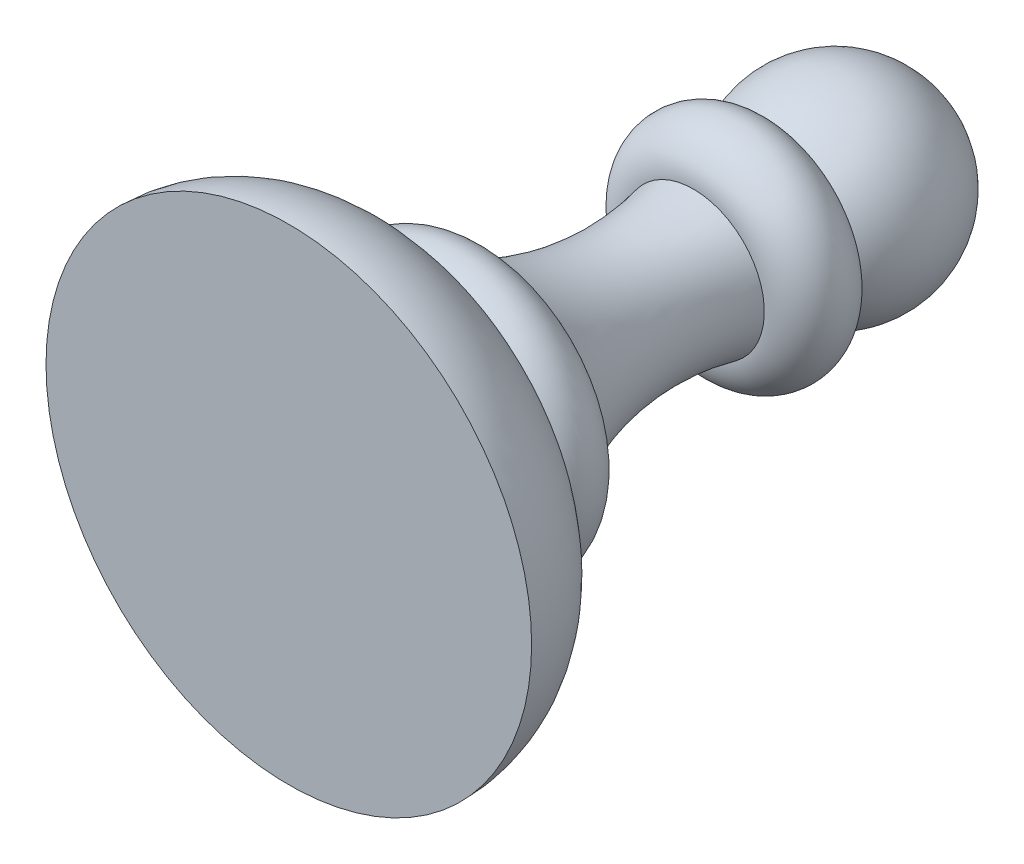
ISO-10303-21;
HEADER;
FILE_DESCRIPTION(('STEP AP214'),'2;1');
FILE_NAME('part.step','',(''),(''),'','','');
FILE_SCHEMA(('AUTOMOTIVE_DESIGN { 1 0 10303 214 1 1 1 1 }'));
ENDSEC;
DATA;
#1=APPLICATION_CONTEXT('core data for automotive mechanical design processes');
#2=APPLICATION_PROTOCOL_DEFINITION('international standard','automotive_design',2000,#1);
#3=PRODUCT_CONTEXT('',#1,'mechanical');
#4=PRODUCT('Part','Part','',(#3));
#5=PRODUCT_RELATED_PRODUCT_CATEGORY('part','',(#4));
#6=PRODUCT_DEFINITION_FORMATION('','',#4);
#7=PRODUCT_DEFINITION_CONTEXT('part definition',#1,'design');
#8=PRODUCT_DEFINITION('design','',#6,#7);
#9=PRODUCT_DEFINITION_SHAPE('','',#8);
#10=(LENGTH_UNIT() NAMED_UNIT(*) SI_UNIT(.MILLI.,.METRE.));
#11=(NAMED_UNIT(*) PLANE_ANGLE_UNIT() SI_UNIT($,.RADIAN.));
#12=(NAMED_UNIT(*) SI_UNIT($,.STERADIAN.) SOLID_ANGLE_UNIT());
#13=UNCERTAINTY_MEASURE_WITH_UNIT(LENGTH_MEASURE(1.E-05),#10,'distance_accuracy_value','');
#14=(GEOMETRIC_REPRESENTATION_CONTEXT(3) GLOBAL_UNCERTAINTY_ASSIGNED_CONTEXT((#13)) GLOBAL_UNIT_ASSIGNED_CONTEXT((#10,
#11,#12)) REPRESENTATION_CONTEXT('',''));
#15=CARTESIAN_POINT('',(0.,0.,0.));
#16=DIRECTION('',(0.,0.,1.));
#17=DIRECTION('',(1.,0.,0.));
#18=AXIS2_PLACEMENT_3D('',#15,#16,#17);
#19=CARTESIAN_POINT('',(0.,0.,135.));
#20=DIRECTION('',(0.,0.,-1.));
#21=DIRECTION('',(-1.,0.,0.));
#22=AXIS2_PLACEMENT_3D('',#19,#20,#21);
#23=PLANE('',#22);
#24=CARTESIAN_POINT('',(0.,0.,135.));
#25=DIRECTION('',(0.,0.,-1.));
#26=DIRECTION('',(-1.,0.,0.));
#27=AXIS2_PLACEMENT_3D('',#24,#25,#26);
#28=CIRCLE('',#27,60.);
#29=CARTESIAN_POINT('',(-60.,0.,135.));
#30=VERTEX_POINT('',#29);
#31=EDGE_CURVE('E10',#30,#30,#28,.T.);
#32=ORIENTED_EDGE('',*,*,#31,.F.);
#33=EDGE_LOOP('',(#32));
#34=FACE_BOUND('',#33,.T.);
#35=ADVANCED_FACE('F40',(#34),#23,.F.);
#36=CARTESIAN_POINT('',(0.,0.,135.));
#37=DIRECTION('',(0.,0.,-1.));
#38=DIRECTION('',(-1.,0.,0.));
#39=AXIS2_PLACEMENT_3D('',#36,#37,#38);
#40=DEGENERATE_TOROIDAL_SURFACE('',#39,30.,30.,.T.);
#41=CARTESIAN_POINT('',(0.,0.,105.));
#42=DIRECTION('',(0.,0.,-1.));
#43=DIRECTION('',(-1.,0.,0.));
#44=AXIS2_PLACEMENT_3D('',#41,#42,#43);
#45=CIRCLE('',#44,30.);
#46=CARTESIAN_POINT('',(-30.,0.,105.));
#47=VERTEX_POINT('',#46);
#48=EDGE_CURVE('E43',#47,#47,#45,.T.);
#49=ORIENTED_EDGE('',*,*,#48,.F.);
#50=EDGE_LOOP('',(#49));
#51=FACE_BOUND('',#50,.T.);
#52=ORIENTED_EDGE('',*,*,#31,.T.);
#53=EDGE_LOOP('',(#52));
#54=FACE_BOUND('',#53,.T.);
#55=ADVANCED_FACE('F85',(#51,#54),#40,.T.);
#56=CARTESIAN_POINT('',(0.,0.,105.));
#57=DIRECTION('',(0.,0.,-1.));
#58=DIRECTION('',(-1.,0.,0.));
#59=AXIS2_PLACEMENT_3D('',#56,#57,#58);
#60=PLANE('',#59);
#61=ORIENTED_EDGE('',*,*,#48,.T.);
#62=EDGE_LOOP('',(#61));
#63=FACE_BOUND('',#62,.T.);
#64=CARTESIAN_POINT('',(0.,0.,105.));
#65=DIRECTION('',(0.,0.,-1.));
#66=DIRECTION('',(-1.,0.,0.));
#67=AXIS2_PLACEMENT_3D('',#64,#65,#66);
#68=CIRCLE('',#67,25.);
#69=CARTESIAN_POINT('',(-25.,0.,105.));
#70=VERTEX_POINT('',#69);
#71=EDGE_CURVE('E50',#70,#70,#68,.T.);
#72=ORIENTED_EDGE('',*,*,#71,.F.);
#73=EDGE_LOOP('',(#72));
#74=FACE_BOUND('',#73,.T.);
#75=ADVANCED_FACE('F78',(#63,#74),#60,.T.);
#76=CARTESIAN_POINT('',(0.,0.,95.));
#77=DIRECTION('',(0.,0.,-1.));
#78=DIRECTION('',(-1.,0.,0.));
#79=AXIS2_PLACEMENT_3D('',#76,#77,#78);
#80=TOROIDAL_SURFACE('',#79,25.,9.99999999999999);
#81=CARTESIAN_POINT('',(0.,0.,85.));
#82=DIRECTION('',(0.,0.,-1.));
#83=DIRECTION('',(-1.,0.,0.));
#84=AXIS2_PLACEMENT_3D('',#81,#82,#83);
#85=CIRCLE('',#84,25.);
#86=CARTESIAN_POINT('',(-25.,0.,85.));
#87=VERTEX_POINT('',#86);
#88=EDGE_CURVE('E51',#87,#87,#85,.T.);
#89=ORIENTED_EDGE('',*,*,#88,.F.);
#90=EDGE_LOOP('',(#89));
#91=FACE_BOUND('',#90,.T.);
#92=ORIENTED_EDGE('',*,*,#71,.T.);
#93=EDGE_LOOP('',(#92));
#94=FACE_BOUND('',#93,.T.);
#95=ADVANCED_FACE('F71',(#91,#94),#80,.T.);
#96=CARTESIAN_POINT('',(0.,0.,50.3169498152599));
#97=DIRECTION('',(0.,0.,-1.));
#98=DIRECTION('',(-1.,0.,0.));
#99=AXIS2_PLACEMENT_3D('',#96,#97,#98);
#100=TOROIDAL_SURFACE('',#99,85.8036678982674,70.);
#101=ORIENTED_EDGE('',*,*,#88,.T.);
#102=EDGE_LOOP('',(#101));
#103=FACE_BOUND('',#102,.T.);
#104=CARTESIAN_POINT('',(0.,0.,35.));
#105=DIRECTION('',(0.,0.,-1.));
#106=DIRECTION('',(-1.,0.,0.));
#107=AXIS2_PLACEMENT_3D('',#104,#105,#106);
#108=CIRCLE('',#107,17.5);
#109=CARTESIAN_POINT('',(-17.5,0.,35.));
#110=VERTEX_POINT('',#109);
#111=EDGE_CURVE('E57',#110,#110,#108,.T.);
#112=ORIENTED_EDGE('',*,*,#111,.F.);
#113=EDGE_LOOP('',(#112));
#114=FACE_BOUND('',#113,.T.);
#115=ADVANCED_FACE('F70',(#103,#114),#100,.F.);
#116=CARTESIAN_POINT('',(0.,0.,25.));
#117=DIRECTION('',(0.,0.,-1.));
#118=DIRECTION('',(-1.,0.,0.));
#119=AXIS2_PLACEMENT_3D('',#116,#117,#118);
#120=TOROIDAL_SURFACE('',#119,17.5,10.);
#121=CARTESIAN_POINT('',(0.,0.,15.2673132860062));
#122=DIRECTION('',(0.,0.,-1.));
#123=DIRECTION('',(-1.,0.,0.));
#124=AXIS2_PLACEMENT_3D('',#121,#122,#123);
#125=CIRCLE('',#124,19.7966953057054);
#126=CARTESIAN_POINT('',(-19.7966953057054,0.,15.2673132860062));
#127=VERTEX_POINT('',#126);
#128=EDGE_CURVE('E56',#127,#127,#125,.T.);
#129=ORIENTED_EDGE('',*,*,#128,.F.);
#130=EDGE_LOOP('',(#129));
#131=FACE_BOUND('',#130,.T.);
#132=ORIENTED_EDGE('',*,*,#111,.T.);
#133=EDGE_LOOP('',(#132));
#134=FACE_BOUND('',#133,.T.);
#135=ADVANCED_FACE('F62',(#131,#134),#120,.T.);
#136=CARTESIAN_POINT('',(0.,0.,0.));
#137=DIRECTION('',(0.,0.,-1.));
#138=DIRECTION('',(1.,0.,0.));
#139=AXIS2_PLACEMENT_3D('',#136,#137,#138);
#140=SPHERICAL_SURFACE('',#139,25.);
#141=ORIENTED_EDGE('',*,*,#128,.T.);
#142=EDGE_LOOP('',(#141));
#143=FACE_BOUND('',#142,.T.);
#144=ADVANCED_FACE('F65',(#143),#140,.T.);
#145=CLOSED_SHELL('',(#35,#55,#75,#95,#115,#135,#144));
#146=MANIFOLD_SOLID_BREP('B2',#145);
#147=ADVANCED_BREP_SHAPE_REPRESENTATION('',(#18,#146),#14);
#148=SHAPE_DEFINITION_REPRESENTATION(#9,#147);
ENDSEC;
END-ISO-10303-21;
